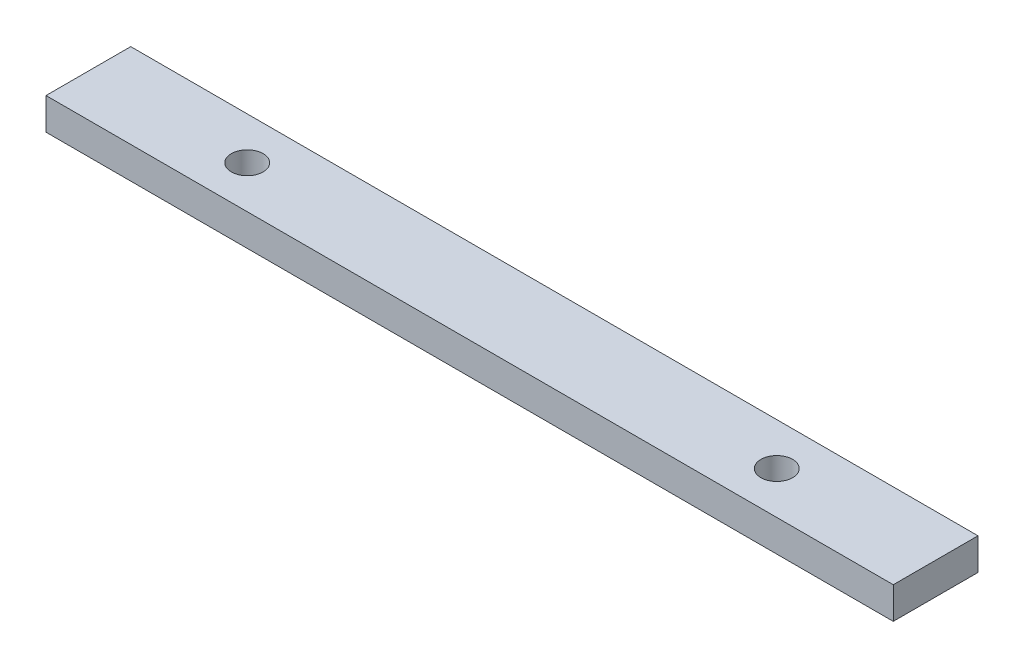
ISO-10303-21;
HEADER;
FILE_DESCRIPTION(('STEP AP214'),'2;1');
FILE_NAME('part.step','',(''),(''),'','','');
FILE_SCHEMA(('AUTOMOTIVE_DESIGN { 1 0 10303 214 1 1 1 1 }'));
ENDSEC;
DATA;
#1=APPLICATION_CONTEXT('core data for automotive mechanical design processes');
#2=APPLICATION_PROTOCOL_DEFINITION('international standard','automotive_design',2000,#1);
#3=PRODUCT_CONTEXT('',#1,'mechanical');
#4=PRODUCT('Part','Part','',(#3));
#5=PRODUCT_RELATED_PRODUCT_CATEGORY('part','',(#4));
#6=PRODUCT_DEFINITION_FORMATION('','',#4);
#7=PRODUCT_DEFINITION_CONTEXT('part definition',#1,'design');
#8=PRODUCT_DEFINITION('design','',#6,#7);
#9=PRODUCT_DEFINITION_SHAPE('','',#8);
#10=(LENGTH_UNIT() NAMED_UNIT(*) SI_UNIT(.MILLI.,.METRE.));
#11=(NAMED_UNIT(*) PLANE_ANGLE_UNIT() SI_UNIT($,.RADIAN.));
#12=(NAMED_UNIT(*) SI_UNIT($,.STERADIAN.) SOLID_ANGLE_UNIT());
#13=UNCERTAINTY_MEASURE_WITH_UNIT(LENGTH_MEASURE(1.E-05),#10,'distance_accuracy_value','');
#14=(GEOMETRIC_REPRESENTATION_CONTEXT(3) GLOBAL_UNCERTAINTY_ASSIGNED_CONTEXT((#13)) GLOBAL_UNIT_ASSIGNED_CONTEXT((#10,
#11,#12)) REPRESENTATION_CONTEXT('',''));
#15=CARTESIAN_POINT('',(0.,0.,0.));
#16=DIRECTION('',(0.,0.,1.));
#17=DIRECTION('',(1.,0.,0.));
#18=AXIS2_PLACEMENT_3D('',#15,#16,#17);
#19=CARTESIAN_POINT('',(0.,3.,0.));
#20=DIRECTION('',(0.,-1.,0.));
#21=DIRECTION('',(0.,0.,-1.));
#22=AXIS2_PLACEMENT_3D('',#19,#20,#21);
#23=PLANE('',#22);
#24=DIRECTION('',(0.,0.,-1.));
#25=VECTOR('',#24,1.);
#26=CARTESIAN_POINT('',(40.,3.,-4.));
#27=LINE('',#26,#25);
#28=CARTESIAN_POINT('',(40.,3.,3.99999999999999));
#29=VERTEX_POINT('',#28);
#30=CARTESIAN_POINT('',(40.,3.,-4.));
#31=VERTEX_POINT('',#30);
#32=EDGE_CURVE('E90',#29,#31,#27,.T.);
#33=ORIENTED_EDGE('',*,*,#32,.T.);
#34=DIRECTION('',(-1.,0.,0.));
#35=VECTOR('',#34,1.);
#36=CARTESIAN_POINT('',(-40.,3.,-4.));
#37=LINE('',#36,#35);
#38=CARTESIAN_POINT('',(-40.,3.,-4.));
#39=VERTEX_POINT('',#38);
#40=EDGE_CURVE('E85',#31,#39,#37,.T.);
#41=ORIENTED_EDGE('',*,*,#40,.T.);
#42=DIRECTION('',(0.,0.,1.));
#43=VECTOR('',#42,1.);
#44=CARTESIAN_POINT('',(-40.,3.,-4.));
#45=LINE('',#44,#43);
#46=CARTESIAN_POINT('',(-40.,3.,4.));
#47=VERTEX_POINT('',#46);
#48=EDGE_CURVE('E88',#39,#47,#45,.T.);
#49=ORIENTED_EDGE('',*,*,#48,.T.);
#50=DIRECTION('',(1.,0.,0.));
#51=VECTOR('',#50,1.);
#52=CARTESIAN_POINT('',(40.,3.,3.99999999999999));
#53=LINE('',#52,#51);
#54=EDGE_CURVE('E55',#47,#29,#53,.T.);
#55=ORIENTED_EDGE('',*,*,#54,.T.);
#56=EDGE_LOOP('',(#33,#41,#49,#55));
#57=FACE_BOUND('',#56,.T.);
#58=CARTESIAN_POINT('',(-25.,3.,0.));
#59=DIRECTION('',(0.,1.,0.));
#60=DIRECTION('',(0.,0.,1.));
#61=AXIS2_PLACEMENT_3D('',#58,#59,#60);
#62=CIRCLE('',#61,1.5);
#63=CARTESIAN_POINT('',(-25.,3.,1.5));
#64=VERTEX_POINT('',#63);
#65=EDGE_CURVE('E105',#64,#64,#62,.T.);
#66=ORIENTED_EDGE('',*,*,#65,.F.);
#67=EDGE_LOOP('',(#66));
#68=FACE_BOUND('',#67,.T.);
#69=CARTESIAN_POINT('',(25.,3.,0.));
#70=DIRECTION('',(0.,1.,0.));
#71=DIRECTION('',(0.,0.,1.));
#72=AXIS2_PLACEMENT_3D('',#69,#70,#71);
#73=CIRCLE('',#72,1.5);
#74=CARTESIAN_POINT('',(25.,3.,1.5));
#75=VERTEX_POINT('',#74);
#76=EDGE_CURVE('E120',#75,#75,#73,.T.);
#77=ORIENTED_EDGE('',*,*,#76,.F.);
#78=EDGE_LOOP('',(#77));
#79=FACE_BOUND('',#78,.T.);
#80=ADVANCED_FACE('F38',(#57,#68,#79),#23,.F.);
#81=CARTESIAN_POINT('',(0.,0.,0.));
#82=DIRECTION('',(0.,-1.,0.));
#83=DIRECTION('',(0.,0.,-1.));
#84=AXIS2_PLACEMENT_3D('',#81,#82,#83);
#85=PLANE('',#84);
#86=CARTESIAN_POINT('',(-25.,0.,0.));
#87=DIRECTION('',(0.,1.,0.));
#88=DIRECTION('',(0.,0.,1.));
#89=AXIS2_PLACEMENT_3D('',#86,#87,#88);
#90=CIRCLE('',#89,1.5);
#91=CARTESIAN_POINT('',(-25.,0.,1.5));
#92=VERTEX_POINT('',#91);
#93=EDGE_CURVE('E117',#92,#92,#90,.T.);
#94=ORIENTED_EDGE('',*,*,#93,.T.);
#95=EDGE_LOOP('',(#94));
#96=FACE_BOUND('',#95,.T.);
#97=DIRECTION('',(0.,0.,-1.));
#98=VECTOR('',#97,1.);
#99=CARTESIAN_POINT('',(40.,0.,-4.));
#100=LINE('',#99,#98);
#101=CARTESIAN_POINT('',(40.,0.,3.99999999999999));
#102=VERTEX_POINT('',#101);
#103=CARTESIAN_POINT('',(40.,0.,-4.));
#104=VERTEX_POINT('',#103);
#105=EDGE_CURVE('E102',#102,#104,#100,.T.);
#106=ORIENTED_EDGE('',*,*,#105,.F.);
#107=DIRECTION('',(1.,0.,0.));
#108=VECTOR('',#107,1.);
#109=CARTESIAN_POINT('',(40.,0.,3.99999999999999));
#110=LINE('',#109,#108);
#111=CARTESIAN_POINT('',(-40.,0.,4.));
#112=VERTEX_POINT('',#111);
#113=EDGE_CURVE('E78',#112,#102,#110,.T.);
#114=ORIENTED_EDGE('',*,*,#113,.F.);
#115=DIRECTION('',(0.,0.,1.));
#116=VECTOR('',#115,1.);
#117=CARTESIAN_POINT('',(-40.,0.,-4.));
#118=LINE('',#117,#116);
#119=CARTESIAN_POINT('',(-40.,0.,-4.));
#120=VERTEX_POINT('',#119);
#121=EDGE_CURVE('E72',#120,#112,#118,.T.);
#122=ORIENTED_EDGE('',*,*,#121,.F.);
#123=DIRECTION('',(-1.,0.,0.));
#124=VECTOR('',#123,1.);
#125=CARTESIAN_POINT('',(-40.,0.,-4.));
#126=LINE('',#125,#124);
#127=EDGE_CURVE('E94',#104,#120,#126,.T.);
#128=ORIENTED_EDGE('',*,*,#127,.F.);
#129=EDGE_LOOP('',(#106,#114,#122,#128));
#130=FACE_BOUND('',#129,.T.);
#131=CARTESIAN_POINT('',(25.,0.,0.));
#132=DIRECTION('',(0.,1.,0.));
#133=DIRECTION('',(0.,0.,1.));
#134=AXIS2_PLACEMENT_3D('',#131,#132,#133);
#135=CIRCLE('',#134,1.5);
#136=CARTESIAN_POINT('',(25.,0.,1.5));
#137=VERTEX_POINT('',#136);
#138=EDGE_CURVE('E123',#137,#137,#135,.T.);
#139=ORIENTED_EDGE('',*,*,#138,.T.);
#140=EDGE_LOOP('',(#139));
#141=FACE_BOUND('',#140,.T.);
#142=ADVANCED_FACE('F113',(#96,#130,#141),#85,.T.);
#143=CARTESIAN_POINT('',(40.,3.,-4.));
#144=DIRECTION('',(-1.,0.,0.));
#145=DIRECTION('',(0.,0.,1.));
#146=AXIS2_PLACEMENT_3D('',#143,#144,#145);
#147=PLANE('',#146);
#148=ORIENTED_EDGE('',*,*,#105,.T.);
#149=DIRECTION('',(0.,-1.,0.));
#150=VECTOR('',#149,1.);
#151=CARTESIAN_POINT('',(40.,3.,-4.));
#152=LINE('',#151,#150);
#153=EDGE_CURVE('E11',#31,#104,#152,.T.);
#154=ORIENTED_EDGE('',*,*,#153,.F.);
#155=ORIENTED_EDGE('',*,*,#32,.F.);
#156=DIRECTION('',(0.,-1.,0.));
#157=VECTOR('',#156,1.);
#158=CARTESIAN_POINT('',(40.,3.,3.99999999999999));
#159=LINE('',#158,#157);
#160=EDGE_CURVE('E98',#29,#102,#159,.T.);
#161=ORIENTED_EDGE('',*,*,#160,.T.);
#162=EDGE_LOOP('',(#148,#154,#155,#161));
#163=FACE_BOUND('',#162,.T.);
#164=ADVANCED_FACE('F40',(#163),#147,.F.);
#165=CARTESIAN_POINT('',(-40.,3.,-4.));
#166=DIRECTION('',(0.,0.,1.));
#167=DIRECTION('',(1.,0.,0.));
#168=AXIS2_PLACEMENT_3D('',#165,#166,#167);
#169=PLANE('',#168);
#170=ORIENTED_EDGE('',*,*,#127,.T.);
#171=DIRECTION('',(0.,-1.,0.));
#172=VECTOR('',#171,1.);
#173=CARTESIAN_POINT('',(-40.,3.,-4.));
#174=LINE('',#173,#172);
#175=EDGE_CURVE('E47',#39,#120,#174,.T.);
#176=ORIENTED_EDGE('',*,*,#175,.F.);
#177=ORIENTED_EDGE('',*,*,#40,.F.);
#178=ORIENTED_EDGE('',*,*,#153,.T.);
#179=EDGE_LOOP('',(#170,#176,#177,#178));
#180=FACE_BOUND('',#179,.T.);
#181=ADVANCED_FACE('F93',(#180),#169,.F.);
#182=CARTESIAN_POINT('',(-40.,3.,-4.));
#183=DIRECTION('',(1.,0.,0.));
#184=DIRECTION('',(0.,0.,-1.));
#185=AXIS2_PLACEMENT_3D('',#182,#183,#184);
#186=PLANE('',#185);
#187=ORIENTED_EDGE('',*,*,#121,.T.);
#188=DIRECTION('',(0.,-1.,0.));
#189=VECTOR('',#188,1.);
#190=CARTESIAN_POINT('',(-40.,3.,4.));
#191=LINE('',#190,#189);
#192=EDGE_CURVE('E95',#47,#112,#191,.T.);
#193=ORIENTED_EDGE('',*,*,#192,.F.);
#194=ORIENTED_EDGE('',*,*,#48,.F.);
#195=ORIENTED_EDGE('',*,*,#175,.T.);
#196=EDGE_LOOP('',(#187,#193,#194,#195));
#197=FACE_BOUND('',#196,.T.);
#198=ADVANCED_FACE('F96',(#197),#186,.F.);
#199=CARTESIAN_POINT('',(40.,3.,3.99999999999999));
#200=DIRECTION('',(0.,0.,-1.));
#201=DIRECTION('',(-1.,0.,0.));
#202=AXIS2_PLACEMENT_3D('',#199,#200,#201);
#203=PLANE('',#202);
#204=ORIENTED_EDGE('',*,*,#113,.T.);
#205=ORIENTED_EDGE('',*,*,#160,.F.);
#206=ORIENTED_EDGE('',*,*,#54,.F.);
#207=ORIENTED_EDGE('',*,*,#192,.T.);
#208=EDGE_LOOP('',(#204,#205,#206,#207));
#209=FACE_BOUND('',#208,.T.);
#210=ADVANCED_FACE('F110',(#209),#203,.F.);
#211=CARTESIAN_POINT('',(-25.,3.,0.));
#212=DIRECTION('',(0.,-1.,0.));
#213=DIRECTION('',(0.,0.,-1.));
#214=AXIS2_PLACEMENT_3D('',#211,#212,#213);
#215=CYLINDRICAL_SURFACE('',#214,1.5);
#216=ORIENTED_EDGE('',*,*,#65,.T.);
#217=EDGE_LOOP('',(#216));
#218=FACE_BOUND('',#217,.T.);
#219=ORIENTED_EDGE('',*,*,#93,.F.);
#220=EDGE_LOOP('',(#219));
#221=FACE_BOUND('',#220,.T.);
#222=ADVANCED_FACE('F140',(#218,#221),#215,.F.);
#223=CARTESIAN_POINT('',(25.,3.,0.));
#224=DIRECTION('',(0.,-1.,0.));
#225=DIRECTION('',(0.,0.,-1.));
#226=AXIS2_PLACEMENT_3D('',#223,#224,#225);
#227=CYLINDRICAL_SURFACE('',#226,1.5);
#228=ORIENTED_EDGE('',*,*,#76,.T.);
#229=EDGE_LOOP('',(#228));
#230=FACE_BOUND('',#229,.T.);
#231=ORIENTED_EDGE('',*,*,#138,.F.);
#232=EDGE_LOOP('',(#231));
#233=FACE_BOUND('',#232,.T.);
#234=ADVANCED_FACE('F129',(#230,#233),#227,.F.);
#235=CLOSED_SHELL('',(#80,#142,#164,#181,#198,#210,#222,#234));
#236=MANIFOLD_SOLID_BREP('B2',#235);
#237=ADVANCED_BREP_SHAPE_REPRESENTATION('',(#18,#236),#14);
#238=SHAPE_DEFINITION_REPRESENTATION(#9,#237);
ENDSEC;
END-ISO-10303-21;
